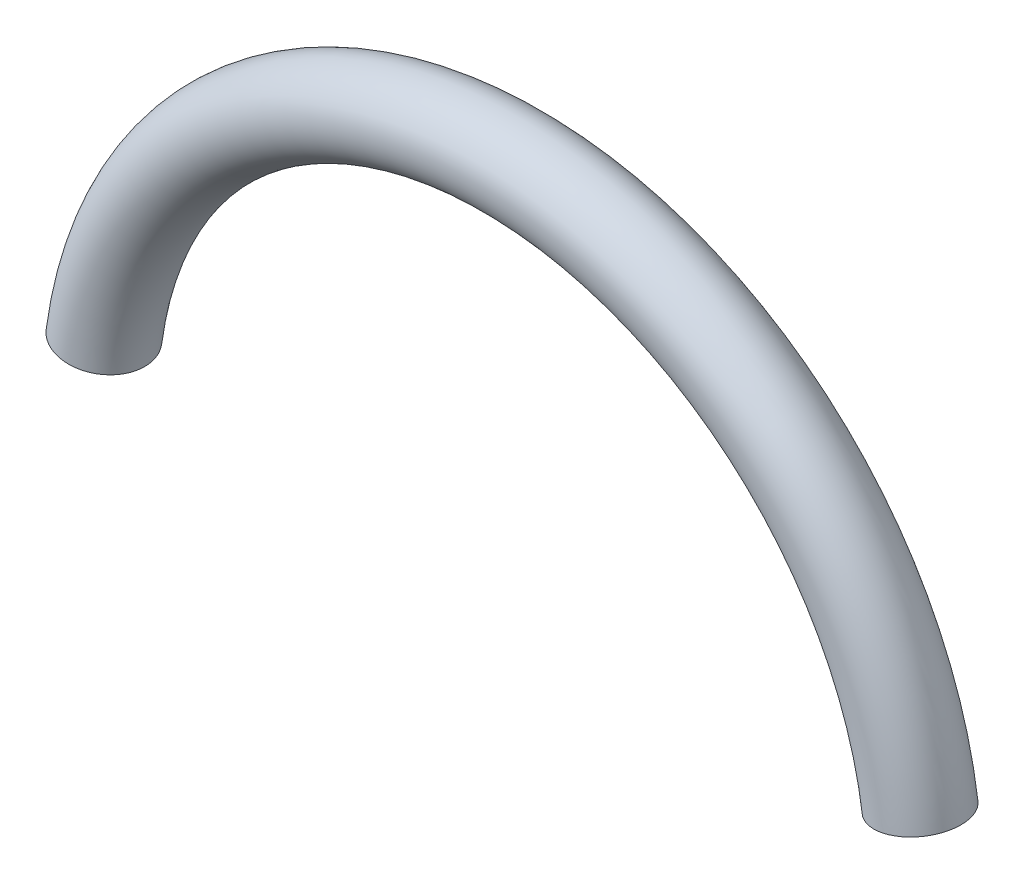
ISO-10303-21;
HEADER;
FILE_DESCRIPTION(('STEP AP214'),'2;1');
FILE_NAME('part.step','',(''),(''),'','','');
FILE_SCHEMA(('AUTOMOTIVE_DESIGN { 1 0 10303 214 1 1 1 1 }'));
ENDSEC;
DATA;
#1=APPLICATION_CONTEXT('core data for automotive mechanical design processes');
#2=APPLICATION_PROTOCOL_DEFINITION('international standard','automotive_design',2000,#1);
#3=PRODUCT_CONTEXT('',#1,'mechanical');
#4=PRODUCT('Part','Part','',(#3));
#5=PRODUCT_RELATED_PRODUCT_CATEGORY('part','',(#4));
#6=PRODUCT_DEFINITION_FORMATION('','',#4);
#7=PRODUCT_DEFINITION_CONTEXT('part definition',#1,'design');
#8=PRODUCT_DEFINITION('design','',#6,#7);
#9=PRODUCT_DEFINITION_SHAPE('','',#8);
#10=(LENGTH_UNIT() NAMED_UNIT(*) SI_UNIT(.MILLI.,.METRE.));
#11=(NAMED_UNIT(*) PLANE_ANGLE_UNIT() SI_UNIT($,.RADIAN.));
#12=(NAMED_UNIT(*) SI_UNIT($,.STERADIAN.) SOLID_ANGLE_UNIT());
#13=UNCERTAINTY_MEASURE_WITH_UNIT(LENGTH_MEASURE(1.E-05),#10,'distance_accuracy_value','');
#14=(GEOMETRIC_REPRESENTATION_CONTEXT(3) GLOBAL_UNCERTAINTY_ASSIGNED_CONTEXT((#13)) GLOBAL_UNIT_ASSIGNED_CONTEXT((#10,
#11,#12)) REPRESENTATION_CONTEXT('',''));
#15=CARTESIAN_POINT('',(0.,0.,0.));
#16=DIRECTION('',(0.,0.,1.));
#17=DIRECTION('',(1.,0.,0.));
#18=AXIS2_PLACEMENT_3D('',#15,#16,#17);
#19=CARTESIAN_POINT('',(-76.8626249999999,112.559034404713,219.8250001));
#20=DIRECTION('',(0.135857807198646,0.990728346330706,0.));
#21=DIRECTION('',(-0.990728346330706,0.135857807198646,0.));
#22=AXIS2_PLACEMENT_3D('',#19,#20,#21);
#23=PLANE('',#22);
#24=CARTESIAN_POINT('',(-76.8626249999999,112.559034404713,219.8250001));
#25=DIRECTION('',(0.135857807198646,0.990728346330706,0.));
#26=DIRECTION('',(-0.990728346330706,0.135857807198646,0.));
#27=AXIS2_PLACEMENT_3D('',#24,#25,#26);
#28=CIRCLE('',#27,3.175);
#29=CARTESIAN_POINT('',(-80.0081874995999,112.990382942569,219.8250001));
#30=VERTEX_POINT('',#29);
#31=EDGE_CURVE('E53',#30,#30,#28,.T.);
#32=ORIENTED_EDGE('',*,*,#31,.F.);
#33=EDGE_LOOP('',(#32));
#34=FACE_BOUND('',#33,.T.);
#35=ADVANCED_FACE('F47',(#34),#23,.F.);
#36=CARTESIAN_POINT('',(-13.9513750080001,112.559034404713,219.825000099999));
#37=DIRECTION('',(0.135857807198648,-0.990728346330706,0.));
#38=DIRECTION('',(0.990728346330706,0.135857807198648,0.));
#39=AXIS2_PLACEMENT_3D('',#36,#37,#38);
#40=PLANE('',#39);
#41=CARTESIAN_POINT('',(-13.9513750080001,112.559034404713,219.825000099999));
#42=DIRECTION('',(0.135857807198648,-0.990728346330706,0.));
#43=DIRECTION('',(0.990728346330706,0.135857807198648,0.));
#44=AXIS2_PLACEMENT_3D('',#41,#42,#43);
#45=CIRCLE('',#44,3.175);
#46=CARTESIAN_POINT('',(-10.8058125084001,112.990382942569,219.825000099999));
#47=VERTEX_POINT('',#46);
#48=EDGE_CURVE('E11',#47,#47,#45,.T.);
#49=ORIENTED_EDGE('',*,*,#48,.T.);
#50=EDGE_LOOP('',(#49));
#51=FACE_BOUND('',#50,.T.);
#52=ADVANCED_FACE('F62',(#51),#40,.T.);
#53=CARTESIAN_POINT('',(-45.407000004,108.245549026156,219.825000099999));
#54=DIRECTION('',(0.,0.,-1.));
#55=DIRECTION('',(0.,1.,0.));
#56=AXIS2_PLACEMENT_3D('',#53,#54,#55);
#57=TOROIDAL_SURFACE('',#56,31.75,3.175);
#58=CARTESIAN_POINT('',(-45.407000004,108.245549026156,219.825000099999));
#59=DIRECTION('',(0.,0.,-1.));
#60=DIRECTION('',(0.,1.,0.));
#61=AXIS2_PLACEMENT_3D('',#58,#59,#60);
#62=CIRCLE('',#61,34.925);
#63=EDGE_CURVE('',#30,#47,#62,.T.);
#64=ORIENTED_EDGE('',*,*,#31,.T.);
#65=ORIENTED_EDGE('',*,*,#48,.F.);
#66=ORIENTED_EDGE('',*,*,#63,.T.);
#67=ORIENTED_EDGE('',*,*,#63,.F.);
#68=EDGE_LOOP('',(#64,#66,#65,#67));
#69=FACE_BOUND('',#68,.T.);
#70=ADVANCED_FACE('F59',(#69),#57,.T.);
#71=CLOSED_SHELL('',(#35,#52,#70));
#72=MANIFOLD_SOLID_BREP('B2',#71);
#73=ADVANCED_BREP_SHAPE_REPRESENTATION('',(#18,#72),#14);
#74=SHAPE_DEFINITION_REPRESENTATION(#9,#73);
ENDSEC;
END-ISO-10303-21;
